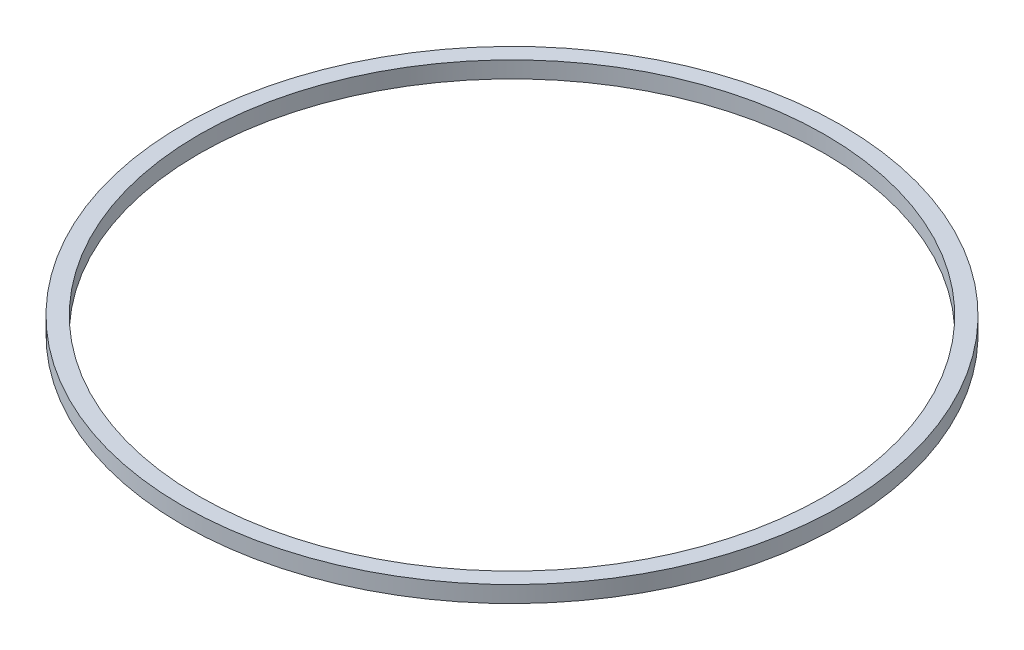
ISO-10303-21;
HEADER;
FILE_DESCRIPTION(('STEP AP214'),'2;1');
FILE_NAME('part.step','',(''),(''),'','','');
FILE_SCHEMA(('AUTOMOTIVE_DESIGN { 1 0 10303 214 1 1 1 1 }'));
ENDSEC;
DATA;
#1=APPLICATION_CONTEXT('core data for automotive mechanical design processes');
#2=APPLICATION_PROTOCOL_DEFINITION('international standard','automotive_design',2000,#1);
#3=PRODUCT_CONTEXT('',#1,'mechanical');
#4=PRODUCT('Part','Part','',(#3));
#5=PRODUCT_RELATED_PRODUCT_CATEGORY('part','',(#4));
#6=PRODUCT_DEFINITION_FORMATION('','',#4);
#7=PRODUCT_DEFINITION_CONTEXT('part definition',#1,'design');
#8=PRODUCT_DEFINITION('design','',#6,#7);
#9=PRODUCT_DEFINITION_SHAPE('','',#8);
#10=(LENGTH_UNIT() NAMED_UNIT(*) SI_UNIT(.MILLI.,.METRE.));
#11=(NAMED_UNIT(*) PLANE_ANGLE_UNIT() SI_UNIT($,.RADIAN.));
#12=(NAMED_UNIT(*) SI_UNIT($,.STERADIAN.) SOLID_ANGLE_UNIT());
#13=UNCERTAINTY_MEASURE_WITH_UNIT(LENGTH_MEASURE(1.E-05),#10,'distance_accuracy_value','');
#14=(GEOMETRIC_REPRESENTATION_CONTEXT(3) GLOBAL_UNCERTAINTY_ASSIGNED_CONTEXT((#13)) GLOBAL_UNIT_ASSIGNED_CONTEXT((#10,
#11,#12)) REPRESENTATION_CONTEXT('',''));
#15=CARTESIAN_POINT('',(0.,0.,0.));
#16=DIRECTION('',(0.,0.,1.));
#17=DIRECTION('',(1.,0.,0.));
#18=AXIS2_PLACEMENT_3D('',#15,#16,#17);
#19=CARTESIAN_POINT('',(0.,10.,0.));
#20=DIRECTION('',(0.,-1.,0.));
#21=DIRECTION('',(0.,0.,-1.));
#22=AXIS2_PLACEMENT_3D('',#19,#20,#21);
#23=CYLINDRICAL_SURFACE('',#22,200.);
#24=CARTESIAN_POINT('',(0.,10.,0.));
#25=DIRECTION('',(0.,1.,0.));
#26=DIRECTION('',(0.,0.,1.));
#27=AXIS2_PLACEMENT_3D('',#24,#25,#26);
#28=CIRCLE('',#27,200.);
#29=CARTESIAN_POINT('',(0.,10.,200.));
#30=VERTEX_POINT('',#29);
#31=EDGE_CURVE('E10',#30,#30,#28,.T.);
#32=ORIENTED_EDGE('',*,*,#31,.F.);
#33=EDGE_LOOP('',(#32));
#34=FACE_BOUND('',#33,.T.);
#35=CARTESIAN_POINT('',(0.,0.,0.));
#36=DIRECTION('',(0.,1.,0.));
#37=DIRECTION('',(0.,0.,1.));
#38=AXIS2_PLACEMENT_3D('',#35,#36,#37);
#39=CIRCLE('',#38,200.);
#40=CARTESIAN_POINT('',(0.,0.,200.));
#41=VERTEX_POINT('',#40);
#42=EDGE_CURVE('E37',#41,#41,#39,.T.);
#43=ORIENTED_EDGE('',*,*,#42,.T.);
#44=EDGE_LOOP('',(#43));
#45=FACE_BOUND('',#44,.T.);
#46=ADVANCED_FACE('F40',(#34,#45),#23,.T.);
#47=CARTESIAN_POINT('',(0.,10.,0.));
#48=DIRECTION('',(0.,1.,0.));
#49=DIRECTION('',(0.,0.,1.));
#50=AXIS2_PLACEMENT_3D('',#47,#48,#49);
#51=PLANE('',#50);
#52=CARTESIAN_POINT('',(0.,10.,0.));
#53=DIRECTION('',(0.,1.,0.));
#54=DIRECTION('',(0.,0.,1.));
#55=AXIS2_PLACEMENT_3D('',#52,#53,#54);
#56=CIRCLE('',#55,190.);
#57=CARTESIAN_POINT('',(0.,10.,190.));
#58=VERTEX_POINT('',#57);
#59=EDGE_CURVE('E47',#58,#58,#56,.T.);
#60=ORIENTED_EDGE('',*,*,#59,.F.);
#61=EDGE_LOOP('',(#60));
#62=FACE_BOUND('',#61,.T.);
#63=ORIENTED_EDGE('',*,*,#31,.T.);
#64=EDGE_LOOP('',(#63));
#65=FACE_BOUND('',#64,.T.);
#66=ADVANCED_FACE('F61',(#62,#65),#51,.T.);
#67=CARTESIAN_POINT('',(0.,0.,0.));
#68=DIRECTION('',(0.,1.,0.));
#69=DIRECTION('',(0.,0.,1.));
#70=AXIS2_PLACEMENT_3D('',#67,#68,#69);
#71=PLANE('',#70);
#72=CARTESIAN_POINT('',(0.,0.,0.));
#73=DIRECTION('',(0.,1.,0.));
#74=DIRECTION('',(0.,0.,1.));
#75=AXIS2_PLACEMENT_3D('',#72,#73,#74);
#76=CIRCLE('',#75,190.);
#77=CARTESIAN_POINT('',(0.,0.,190.));
#78=VERTEX_POINT('',#77);
#79=EDGE_CURVE('E50',#78,#78,#76,.T.);
#80=ORIENTED_EDGE('',*,*,#79,.T.);
#81=EDGE_LOOP('',(#80));
#82=FACE_BOUND('',#81,.T.);
#83=ORIENTED_EDGE('',*,*,#42,.F.);
#84=EDGE_LOOP('',(#83));
#85=FACE_BOUND('',#84,.T.);
#86=ADVANCED_FACE('F54',(#82,#85),#71,.F.);
#87=CARTESIAN_POINT('',(0.,0.,0.));
#88=DIRECTION('',(0.,1.,0.));
#89=DIRECTION('',(0.,0.,1.));
#90=AXIS2_PLACEMENT_3D('',#87,#88,#89);
#91=CYLINDRICAL_SURFACE('',#90,190.);
#92=ORIENTED_EDGE('',*,*,#79,.F.);
#93=EDGE_LOOP('',(#92));
#94=FACE_BOUND('',#93,.T.);
#95=ORIENTED_EDGE('',*,*,#59,.T.);
#96=EDGE_LOOP('',(#95));
#97=FACE_BOUND('',#96,.T.);
#98=ADVANCED_FACE('F59',(#94,#97),#91,.F.);
#99=CLOSED_SHELL('',(#46,#66,#86,#98));
#100=MANIFOLD_SOLID_BREP('B2',#99);
#101=ADVANCED_BREP_SHAPE_REPRESENTATION('',(#18,#100),#14);
#102=SHAPE_DEFINITION_REPRESENTATION(#9,#101);
ENDSEC;
END-ISO-10303-21;
